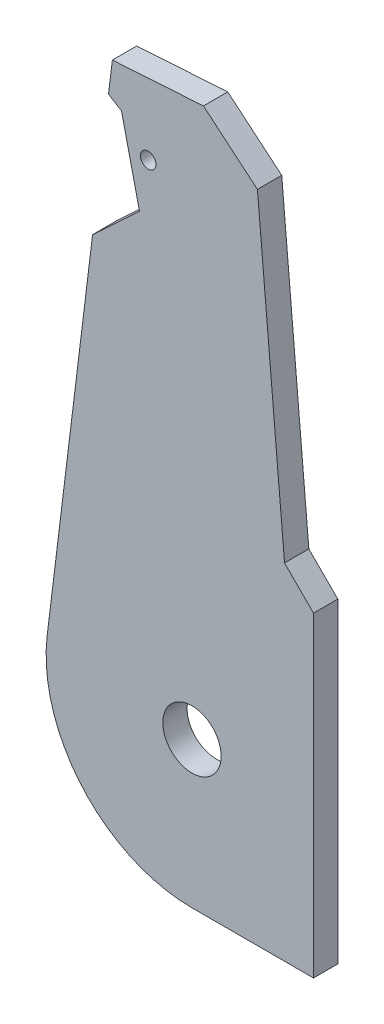
ISO-10303-21;
HEADER;
FILE_DESCRIPTION(('STEP AP214'),'2;1');
FILE_NAME('part.step','',(''),(''),'','','');
FILE_SCHEMA(('AUTOMOTIVE_DESIGN { 1 0 10303 214 1 1 1 1 }'));
ENDSEC;
DATA;
#1=APPLICATION_CONTEXT('core data for automotive mechanical design processes');
#2=APPLICATION_PROTOCOL_DEFINITION('international standard','automotive_design',2000,#1);
#3=PRODUCT_CONTEXT('',#1,'mechanical');
#4=PRODUCT('Part','Part','',(#3));
#5=PRODUCT_RELATED_PRODUCT_CATEGORY('part','',(#4));
#6=PRODUCT_DEFINITION_FORMATION('','',#4);
#7=PRODUCT_DEFINITION_CONTEXT('part definition',#1,'design');
#8=PRODUCT_DEFINITION('design','',#6,#7);
#9=PRODUCT_DEFINITION_SHAPE('','',#8);
#10=(LENGTH_UNIT() NAMED_UNIT(*) SI_UNIT(.MILLI.,.METRE.));
#11=(NAMED_UNIT(*) PLANE_ANGLE_UNIT() SI_UNIT($,.RADIAN.));
#12=(NAMED_UNIT(*) SI_UNIT($,.STERADIAN.) SOLID_ANGLE_UNIT());
#13=UNCERTAINTY_MEASURE_WITH_UNIT(LENGTH_MEASURE(1.E-05),#10,'distance_accuracy_value','');
#14=(GEOMETRIC_REPRESENTATION_CONTEXT(3) GLOBAL_UNCERTAINTY_ASSIGNED_CONTEXT((#13)) GLOBAL_UNIT_ASSIGNED_CONTEXT((#10,
#11,#12)) REPRESENTATION_CONTEXT('',''));
#15=CARTESIAN_POINT('',(0.,0.,0.));
#16=DIRECTION('',(0.,0.,1.));
#17=DIRECTION('',(1.,0.,0.));
#18=AXIS2_PLACEMENT_3D('',#15,#16,#17);
#19=CARTESIAN_POINT('',(-120.559989647342,113.233576825008,8.79187761701347));
#20=DIRECTION('',(0.992546151641323,-0.121869343405144,0.));
#21=DIRECTION('',(0.121869343405144,0.992546151641323,0.));
#22=AXIS2_PLACEMENT_3D('',#19,#20,#21);
#23=PLANE('',#22);
#24=DIRECTION('',(-0.121869343405144,-0.992546151641323,0.));
#25=VECTOR('',#24,1.);
#26=CARTESIAN_POINT('',(-120.559989647342,113.233576825008,8.79187761701347));
#27=LINE('',#26,#25);
#28=CARTESIAN_POINT('',(-124.628014575351,80.1021725336627,8.79187761701347));
#29=VERTEX_POINT('',#28);
#30=CARTESIAN_POINT('',(-133.965617421908,4.0535001444623,8.79187761701347));
#31=VERTEX_POINT('',#30);
#32=EDGE_CURVE('E161',#29,#31,#27,.T.);
#33=ORIENTED_EDGE('',*,*,#32,.F.);
#34=DIRECTION('',(0.,0.,-1.));
#35=VECTOR('',#34,1.);
#36=CARTESIAN_POINT('',(-124.628014575352,80.1021725336627,8.79187761701347));
#37=LINE('',#36,#35);
#38=CARTESIAN_POINT('',(-124.628014575351,80.1021725336627,3.79187761701347));
#39=VERTEX_POINT('',#38);
#40=EDGE_CURVE('E172',#29,#39,#37,.T.);
#41=ORIENTED_EDGE('',*,*,#40,.T.);
#42=DIRECTION('',(-0.121869343405144,-0.992546151641323,0.));
#43=VECTOR('',#42,1.);
#44=CARTESIAN_POINT('',(-120.559989647342,113.233576825008,3.79187761701347));
#45=LINE('',#44,#43);
#46=CARTESIAN_POINT('',(-133.965617421908,4.0535001444623,3.79187761701347));
#47=VERTEX_POINT('',#46);
#48=EDGE_CURVE('E154',#39,#47,#45,.T.);
#49=ORIENTED_EDGE('',*,*,#48,.T.);
#50=DIRECTION('',(0.,0.,-1.));
#51=VECTOR('',#50,1.);
#52=CARTESIAN_POINT('',(-133.965617421908,4.0535001444623,8.79187761701347));
#53=LINE('',#52,#51);
#54=EDGE_CURVE('E166',#31,#47,#53,.T.);
#55=ORIENTED_EDGE('',*,*,#54,.F.);
#56=EDGE_LOOP('',(#33,#41,#49,#55));
#57=FACE_BOUND('',#56,.T.);
#58=ADVANCED_FACE('F35',(#57),#23,.F.);
#59=CARTESIAN_POINT('',(-104.189232872668,0.397419842307961,8.79187761701347));
#60=DIRECTION('',(0.,0.,-1.));
#61=DIRECTION('',(-1.,0.,0.));
#62=AXIS2_PLACEMENT_3D('',#59,#60,#61);
#63=PLANE('',#62);
#64=CARTESIAN_POINT('',(-113.189232872668,99.0937134958599,8.79187761701347));
#65=DIRECTION('',(0.,0.,-1.));
#66=DIRECTION('',(-1.,0.,0.));
#67=AXIS2_PLACEMENT_3D('',#64,#65,#66);
#68=CIRCLE('',#67,1.60000000000001);
#69=CARTESIAN_POINT('',(-114.789232872668,99.0937134958599,8.79187761701347));
#70=VERTEX_POINT('',#69);
#71=EDGE_CURVE('E226',#70,#70,#68,.T.);
#72=ORIENTED_EDGE('',*,*,#71,.T.);
#73=EDGE_LOOP('',(#72));
#74=FACE_BOUND('',#73,.T.);
#75=DIRECTION('',(1.,0.,0.));
#76=VECTOR('',#75,1.);
#77=CARTESIAN_POINT('',(-104.189232872668,-29.6025801576921,8.79187761701347));
#78=LINE('',#77,#76);
#79=CARTESIAN_POINT('',(-104.189232872668,-29.6025801576921,8.79187761701347));
#80=VERTEX_POINT('',#79);
#81=CARTESIAN_POINT('',(-79.19,-29.6025801576921,8.79187761701347));
#82=VERTEX_POINT('',#81);
#83=EDGE_CURVE('E131',#80,#82,#78,.T.);
#84=ORIENTED_EDGE('',*,*,#83,.T.);
#85=DIRECTION('',(0.,-1.,0.));
#86=VECTOR('',#85,1.);
#87=CARTESIAN_POINT('',(-79.19,114.43980887269,8.79187761701347));
#88=LINE('',#87,#86);
#89=CARTESIAN_POINT('',(-79.19,35.3981869696397,8.79187761701347));
#90=VERTEX_POINT('',#89);
#91=EDGE_CURVE('E120',#90,#82,#88,.T.);
#92=ORIENTED_EDGE('',*,*,#91,.F.);
#93=DIRECTION('',(0.707106781186543,-0.707106781186553,0.));
#94=VECTOR('',#93,1.);
#95=CARTESIAN_POINT('',(-74.1892328726681,30.3974198423077,8.79187761701347));
#96=LINE('',#95,#94);
#97=CARTESIAN_POINT('',(-85.1480008356394,41.3561878052792,8.79187761701347));
#98=VERTEX_POINT('',#97);
#99=EDGE_CURVE('E43',#90,#98,#96,.F.);
#100=ORIENTED_EDGE('',*,*,#99,.T.);
#101=DIRECTION('',(-0.0871557427476619,0.996194698091745,0.));
#102=VECTOR('',#101,1.);
#103=CARTESIAN_POINT('',(-91.5974710062196,115.073969180106,8.79187761701347));
#104=LINE('',#103,#102);
#105=CARTESIAN_POINT('',(-90.7259135787429,105.112022199189,8.79187761701347));
#106=VERTEX_POINT('',#105);
#107=EDGE_CURVE('E140',#98,#106,#104,.T.);
#108=ORIENTED_EDGE('',*,*,#107,.T.);
#109=DIRECTION('',(0.766044443118979,-0.642787609686538,0.));
#110=VECTOR('',#109,1.);
#111=CARTESIAN_POINT('',(-101.823681913159,114.424155515488,8.79187761701347));
#112=LINE('',#111,#110);
#113=CARTESIAN_POINT('',(-101.823681913159,114.424155515488,8.79187761701347));
#114=VERTEX_POINT('',#113);
#115=EDGE_CURVE('E184',#106,#114,#112,.F.);
#116=ORIENTED_EDGE('',*,*,#115,.T.);
#117=DIRECTION('',(-0.997987177795872,-0.0634160307416799,0.));
#118=VECTOR('',#117,1.);
#119=CARTESIAN_POINT('',(-120.559989647342,113.233576825008,8.79187761701347));
#120=LINE('',#119,#118);
#121=CARTESIAN_POINT('',(-120.559989647342,113.233576825008,8.79187761701347));
#122=VERTEX_POINT('',#121);
#123=EDGE_CURVE('E142',#114,#122,#120,.T.);
#124=ORIENTED_EDGE('',*,*,#123,.T.);
#125=CARTESIAN_POINT('',(-121.354234214666,106.764973920187,8.79187761701347));
#126=VERTEX_POINT('',#125);
#127=EDGE_CURVE('E144',#122,#126,#27,.T.);
#128=ORIENTED_EDGE('',*,*,#127,.T.);
#129=DIRECTION('',(0.848048096156423,-0.529919264233209,0.));
#130=VECTOR('',#129,1.);
#131=CARTESIAN_POINT('',(-61.2081507199019,69.1815297069292,8.79187761701347));
#132=LINE('',#131,#130);
#133=CARTESIAN_POINT('',(-118.679658450595,105.09371349586,8.79187761701347));
#134=VERTEX_POINT('',#133);
#135=EDGE_CURVE('E232',#126,#134,#132,.T.);
#136=ORIENTED_EDGE('',*,*,#135,.T.);
#137=DIRECTION('',(0.224951054343871,-0.974370064785234,0.));
#138=VECTOR('',#137,1.);
#139=CARTESIAN_POINT('',(-94.9984826237853,2.51927172735446,8.79187761701347));
#140=LINE('',#139,#138);
#141=CARTESIAN_POINT('',(-114.985767392586,89.0937134958599,8.79187761701347));
#142=VERTEX_POINT('',#141);
#143=EDGE_CURVE('E221',#134,#142,#140,.T.);
#144=ORIENTED_EDGE('',*,*,#143,.T.);
#145=DIRECTION('',(-0.731353701619163,-0.681998360062506,0.));
#146=VECTOR('',#145,1.);
#147=CARTESIAN_POINT('',(-153.45105301428,53.2242543610352,8.79187761701347));
#148=LINE('',#147,#146);
#149=EDGE_CURVE('E229',#142,#29,#148,.T.);
#150=ORIENTED_EDGE('',*,*,#149,.T.);
#151=ORIENTED_EDGE('',*,*,#32,.T.);
#152=CARTESIAN_POINT('',(-104.189232872668,0.397419842307961,8.79187761701347));
#153=DIRECTION('',(0.,0.,1.));
#154=DIRECTION('',(-1.,0.,0.));
#155=AXIS2_PLACEMENT_3D('',#152,#153,#154);
#156=CIRCLE('',#155,30.);
#157=EDGE_CURVE('E138',#31,#80,#156,.T.);
#158=ORIENTED_EDGE('',*,*,#157,.T.);
#159=EDGE_LOOP('',(#84,#92,#100,#108,#116,#124,#128,#136,#144,#150,#151,#158));
#160=FACE_BOUND('',#159,.T.);
#161=CARTESIAN_POINT('',(-104.189232872668,0.397419842307961,8.79187761701347));
#162=DIRECTION('',(0.,0.,1.));
#163=DIRECTION('',(1.,0.,0.));
#164=AXIS2_PLACEMENT_3D('',#161,#162,#163);
#165=CIRCLE('',#164,6.);
#166=CARTESIAN_POINT('',(-98.1892328726683,0.397419842307961,8.79187761701347));
#167=VERTEX_POINT('',#166);
#168=EDGE_CURVE('E220',#167,#167,#165,.T.);
#169=ORIENTED_EDGE('',*,*,#168,.F.);
#170=EDGE_LOOP('',(#169));
#171=FACE_BOUND('',#170,.T.);
#172=ADVANCED_FACE('F135',(#74,#160,#171),#63,.F.);
#173=CARTESIAN_POINT('',(-104.189232872668,0.397419842307961,3.79187761701347));
#174=DIRECTION('',(0.,0.,-1.));
#175=DIRECTION('',(-1.,0.,0.));
#176=AXIS2_PLACEMENT_3D('',#173,#174,#175);
#177=PLANE('',#176);
#178=DIRECTION('',(0.,1.,0.));
#179=VECTOR('',#178,1.);
#180=CARTESIAN_POINT('',(-79.19,0.397419842307964,3.79187761701347));
#181=LINE('',#180,#179);
#182=CARTESIAN_POINT('',(-79.19,-29.6025801576921,3.79187761701347));
#183=VERTEX_POINT('',#182);
#184=CARTESIAN_POINT('',(-79.19,35.3981869696397,3.79187761701347));
#185=VERTEX_POINT('',#184);
#186=EDGE_CURVE('E50',#183,#185,#181,.T.);
#187=ORIENTED_EDGE('',*,*,#186,.F.);
#188=DIRECTION('',(1.,0.,0.));
#189=VECTOR('',#188,1.);
#190=CARTESIAN_POINT('',(-104.189232872668,-29.6025801576921,3.79187761701347));
#191=LINE('',#190,#189);
#192=CARTESIAN_POINT('',(-104.189232872668,-29.6025801576921,3.79187761701347));
#193=VERTEX_POINT('',#192);
#194=EDGE_CURVE('E133',#193,#183,#191,.T.);
#195=ORIENTED_EDGE('',*,*,#194,.F.);
#196=CARTESIAN_POINT('',(-104.189232872668,0.397419842307961,3.79187761701347));
#197=DIRECTION('',(0.,0.,1.));
#198=DIRECTION('',(-1.,0.,0.));
#199=AXIS2_PLACEMENT_3D('',#196,#197,#198);
#200=CIRCLE('',#199,30.);
#201=EDGE_CURVE('E153',#47,#193,#200,.T.);
#202=ORIENTED_EDGE('',*,*,#201,.F.);
#203=ORIENTED_EDGE('',*,*,#48,.F.);
#204=DIRECTION('',(-0.731353701619164,-0.681998360062506,0.));
#205=VECTOR('',#204,1.);
#206=CARTESIAN_POINT('',(-124.628014575351,80.1021725336627,3.79187761701347));
#207=LINE('',#206,#205);
#208=CARTESIAN_POINT('',(-114.985767392586,89.0937134958599,3.79187761701347));
#209=VERTEX_POINT('',#208);
#210=EDGE_CURVE('E240',#209,#39,#207,.T.);
#211=ORIENTED_EDGE('',*,*,#210,.F.);
#212=DIRECTION('',(0.224951054343871,-0.974370064785234,0.));
#213=VECTOR('',#212,1.);
#214=CARTESIAN_POINT('',(-118.679658450595,105.09371349586,3.79187761701347));
#215=LINE('',#214,#213);
#216=CARTESIAN_POINT('',(-118.679658450595,105.09371349586,3.79187761701347));
#217=VERTEX_POINT('',#216);
#218=EDGE_CURVE('E243',#217,#209,#215,.T.);
#219=ORIENTED_EDGE('',*,*,#218,.F.);
#220=DIRECTION('',(0.848048096156423,-0.529919264233209,0.));
#221=VECTOR('',#220,1.);
#222=CARTESIAN_POINT('',(-118.679658450595,105.09371349586,3.79187761701347));
#223=LINE('',#222,#221);
#224=CARTESIAN_POINT('',(-121.354234214666,106.764973920187,3.79187761701347));
#225=VERTEX_POINT('',#224);
#226=EDGE_CURVE('E246',#225,#217,#223,.T.);
#227=ORIENTED_EDGE('',*,*,#226,.F.);
#228=CARTESIAN_POINT('',(-120.559989647342,113.233576825008,3.79187761701347));
#229=VERTEX_POINT('',#228);
#230=EDGE_CURVE('E150',#229,#225,#45,.T.);
#231=ORIENTED_EDGE('',*,*,#230,.F.);
#232=DIRECTION('',(-0.997987177795872,-0.0634160307416799,0.));
#233=VECTOR('',#232,1.);
#234=CARTESIAN_POINT('',(-120.559989647342,113.233576825008,3.79187761701347));
#235=LINE('',#234,#233);
#236=CARTESIAN_POINT('',(-101.823681913159,114.424155515488,3.79187761701347));
#237=VERTEX_POINT('',#236);
#238=EDGE_CURVE('E159',#237,#229,#235,.T.);
#239=ORIENTED_EDGE('',*,*,#238,.F.);
#240=DIRECTION('',(-0.766044443118979,0.642787609686538,0.));
#241=VECTOR('',#240,1.);
#242=CARTESIAN_POINT('',(-47.0646375287514,68.4758615689116,3.79187761701347));
#243=LINE('',#242,#241);
#244=CARTESIAN_POINT('',(-90.7259135787429,105.112022199189,3.79187761701347));
#245=VERTEX_POINT('',#244);
#246=EDGE_CURVE('E178',#237,#245,#243,.F.);
#247=ORIENTED_EDGE('',*,*,#246,.T.);
#248=DIRECTION('',(-0.0871557427476619,0.996194698091745,0.));
#249=VECTOR('',#248,1.);
#250=CARTESIAN_POINT('',(-91.5974710062196,115.073969180106,3.79187761701347));
#251=LINE('',#250,#249);
#252=CARTESIAN_POINT('',(-85.1480008356394,41.3561878052792,3.79187761701347));
#253=VERTEX_POINT('',#252);
#254=EDGE_CURVE('E157',#253,#245,#251,.T.);
#255=ORIENTED_EDGE('',*,*,#254,.F.);
#256=DIRECTION('',(-0.707106781186543,0.707106781186553,0.));
#257=VECTOR('',#256,1.);
#258=CARTESIAN_POINT('',(-85.1480008356394,41.3561878052792,3.79187761701347));
#259=LINE('',#258,#257);
#260=EDGE_CURVE('E189',#253,#185,#259,.F.);
#261=ORIENTED_EDGE('',*,*,#260,.T.);
#262=EDGE_LOOP('',(#187,#195,#202,#203,#211,#219,#227,#231,#239,#247,#255,#261));
#263=FACE_BOUND('',#262,.T.);
#264=CARTESIAN_POINT('',(-113.189232872668,99.0937134958599,3.79187761701347));
#265=DIRECTION('',(0.,0.,-1.));
#266=DIRECTION('',(-1.,0.,0.));
#267=AXIS2_PLACEMENT_3D('',#264,#265,#266);
#268=CIRCLE('',#267,1.60000000000001);
#269=CARTESIAN_POINT('',(-114.789232872668,99.0937134958599,3.79187761701347));
#270=VERTEX_POINT('',#269);
#271=EDGE_CURVE('E234',#270,#270,#268,.T.);
#272=ORIENTED_EDGE('',*,*,#271,.F.);
#273=EDGE_LOOP('',(#272));
#274=FACE_BOUND('',#273,.T.);
#275=CARTESIAN_POINT('',(-104.189232872668,0.397419842307961,3.79187761701347));
#276=DIRECTION('',(0.,0.,1.));
#277=DIRECTION('',(1.,0.,0.));
#278=AXIS2_PLACEMENT_3D('',#275,#276,#277);
#279=CIRCLE('',#278,6.);
#280=CARTESIAN_POINT('',(-98.1892328726683,0.397419842307961,3.79187761701347));
#281=VERTEX_POINT('',#280);
#282=EDGE_CURVE('E217',#281,#281,#279,.T.);
#283=ORIENTED_EDGE('',*,*,#282,.T.);
#284=EDGE_LOOP('',(#283));
#285=FACE_BOUND('',#284,.T.);
#286=ADVANCED_FACE('F193',(#263,#274,#285),#177,.T.);
#287=ORIENTED_EDGE('',*,*,#230,.T.);
#288=DIRECTION('',(0.,0.,1.));
#289=VECTOR('',#288,1.);
#290=CARTESIAN_POINT('',(-121.354234214666,106.764973920187,8.79187761701347));
#291=LINE('',#290,#289);
#292=EDGE_CURVE('E169',#225,#126,#291,.T.);
#293=ORIENTED_EDGE('',*,*,#292,.T.);
#294=ORIENTED_EDGE('',*,*,#127,.F.);
#295=DIRECTION('',(0.,0.,-1.));
#296=VECTOR('',#295,1.);
#297=CARTESIAN_POINT('',(-120.559989647342,113.233576825008,8.79187761701347));
#298=LINE('',#297,#296);
#299=EDGE_CURVE('E149',#122,#229,#298,.T.);
#300=ORIENTED_EDGE('',*,*,#299,.T.);
#301=EDGE_LOOP('',(#287,#293,#294,#300));
#302=FACE_BOUND('',#301,.T.);
#303=ADVANCED_FACE('F214',(#302),#23,.F.);
#304=CARTESIAN_POINT('',(-104.189232872668,0.397419842307961,8.79187761701347));
#305=DIRECTION('',(0.,0.,-1.));
#306=DIRECTION('',(-1.,0.,0.));
#307=AXIS2_PLACEMENT_3D('',#304,#305,#306);
#308=CYLINDRICAL_SURFACE('',#307,30.);
#309=ORIENTED_EDGE('',*,*,#201,.T.);
#310=DIRECTION('',(0.,0.,-1.));
#311=VECTOR('',#310,1.);
#312=CARTESIAN_POINT('',(-104.189232872668,-29.6025801576921,8.79187761701347));
#313=LINE('',#312,#311);
#314=EDGE_CURVE('E164',#80,#193,#313,.T.);
#315=ORIENTED_EDGE('',*,*,#314,.F.);
#316=ORIENTED_EDGE('',*,*,#157,.F.);
#317=ORIENTED_EDGE('',*,*,#54,.T.);
#318=EDGE_LOOP('',(#309,#315,#316,#317));
#319=FACE_BOUND('',#318,.T.);
#320=ADVANCED_FACE('F264',(#319),#308,.T.);
#321=CARTESIAN_POINT('',(-104.189232872668,-29.6025801576921,8.79187761701347));
#322=DIRECTION('',(0.,1.,0.));
#323=DIRECTION('',(-1.,0.,0.));
#324=AXIS2_PLACEMENT_3D('',#321,#322,#323);
#325=PLANE('',#324);
#326=ORIENTED_EDGE('',*,*,#194,.T.);
#327=DIRECTION('',(0.,0.,1.));
#328=VECTOR('',#327,1.);
#329=CARTESIAN_POINT('',(-79.19,-29.6025801576921,-1.20812238298653));
#330=LINE('',#329,#328);
#331=EDGE_CURVE('E123',#183,#82,#330,.T.);
#332=ORIENTED_EDGE('',*,*,#331,.T.);
#333=ORIENTED_EDGE('',*,*,#83,.F.);
#334=ORIENTED_EDGE('',*,*,#314,.T.);
#335=EDGE_LOOP('',(#326,#332,#333,#334));
#336=FACE_BOUND('',#335,.T.);
#337=ADVANCED_FACE('F129',(#336),#325,.F.);
#338=CARTESIAN_POINT('',(-91.5974710062196,115.073969180106,8.79187761701347));
#339=DIRECTION('',(-0.996194698091745,-0.0871557427476619,0.));
#340=DIRECTION('',(0.0871557427476619,-0.996194698091745,0.));
#341=AXIS2_PLACEMENT_3D('',#338,#339,#340);
#342=PLANE('',#341);
#343=ORIENTED_EDGE('',*,*,#107,.F.);
#344=DIRECTION('',(0.,0.,-1.));
#345=VECTOR('',#344,1.);
#346=CARTESIAN_POINT('',(-85.1480008356394,41.3561878052792,3.79187761701347));
#347=LINE('',#346,#345);
#348=EDGE_CURVE('E186',#98,#253,#347,.T.);
#349=ORIENTED_EDGE('',*,*,#348,.T.);
#350=ORIENTED_EDGE('',*,*,#254,.T.);
#351=DIRECTION('',(0.,0.,1.));
#352=VECTOR('',#351,1.);
#353=CARTESIAN_POINT('',(-90.7259135787429,105.112022199189,8.79187761701347));
#354=LINE('',#353,#352);
#355=EDGE_CURVE('E181',#245,#106,#354,.T.);
#356=ORIENTED_EDGE('',*,*,#355,.T.);
#357=EDGE_LOOP('',(#343,#349,#350,#356));
#358=FACE_BOUND('',#357,.T.);
#359=ADVANCED_FACE('F198',(#358),#342,.F.);
#360=CARTESIAN_POINT('',(-120.559989647342,113.233576825008,8.79187761701347));
#361=DIRECTION('',(0.0634160307416799,-0.997987177795872,0.));
#362=DIRECTION('',(0.997987177795872,0.0634160307416799,0.));
#363=AXIS2_PLACEMENT_3D('',#360,#361,#362);
#364=PLANE('',#363);
#365=ORIENTED_EDGE('',*,*,#123,.F.);
#366=DIRECTION('',(0.,0.,-1.));
#367=VECTOR('',#366,1.);
#368=CARTESIAN_POINT('',(-101.823681913159,114.424155515488,8.79187761701347));
#369=LINE('',#368,#367);
#370=EDGE_CURVE('E175',#114,#237,#369,.T.);
#371=ORIENTED_EDGE('',*,*,#370,.T.);
#372=ORIENTED_EDGE('',*,*,#238,.T.);
#373=ORIENTED_EDGE('',*,*,#299,.F.);
#374=EDGE_LOOP('',(#365,#371,#372,#373));
#375=FACE_BOUND('',#374,.T.);
#376=ADVANCED_FACE('F207',(#375),#364,.F.);
#377=CARTESIAN_POINT('',(-104.189232872668,0.397419842307961,8.79187761701347));
#378=DIRECTION('',(0.,0.,-1.));
#379=DIRECTION('',(-1.,0.,0.));
#380=AXIS2_PLACEMENT_3D('',#377,#378,#379);
#381=CYLINDRICAL_SURFACE('',#380,6.);
#382=ORIENTED_EDGE('',*,*,#168,.T.);
#383=EDGE_LOOP('',(#382));
#384=FACE_BOUND('',#383,.T.);
#385=ORIENTED_EDGE('',*,*,#282,.F.);
#386=EDGE_LOOP('',(#385));
#387=FACE_BOUND('',#386,.T.);
#388=ADVANCED_FACE('F295',(#384,#387),#381,.F.);
#389=CARTESIAN_POINT('',(-118.679658450595,105.09371349586,28.7918776170135));
#390=DIRECTION('',(0.974370064785234,0.224951054343871,0.));
#391=DIRECTION('',(-0.224951054343871,0.974370064785234,0.));
#392=AXIS2_PLACEMENT_3D('',#389,#390,#391);
#393=PLANE('',#392);
#394=DIRECTION('',(0.,0.,-1.));
#395=VECTOR('',#394,1.);
#396=CARTESIAN_POINT('',(-118.679658450595,105.09371349586,28.7918776170135));
#397=LINE('',#396,#395);
#398=EDGE_CURVE('E238',#134,#217,#397,.T.);
#399=ORIENTED_EDGE('',*,*,#398,.T.);
#400=ORIENTED_EDGE('',*,*,#218,.T.);
#401=DIRECTION('',(0.,0.,-1.));
#402=VECTOR('',#401,1.);
#403=CARTESIAN_POINT('',(-114.985767392586,89.0937134958599,28.7918776170135));
#404=LINE('',#403,#402);
#405=EDGE_CURVE('E237',#142,#209,#404,.T.);
#406=ORIENTED_EDGE('',*,*,#405,.F.);
#407=ORIENTED_EDGE('',*,*,#143,.F.);
#408=EDGE_LOOP('',(#399,#400,#406,#407));
#409=FACE_BOUND('',#408,.T.);
#410=ADVANCED_FACE('F257',(#409),#393,.F.);
#411=CARTESIAN_POINT('',(-124.628014575351,80.1021725336627,28.7918776170135));
#412=DIRECTION('',(0.681998360062506,-0.731353701619163,0.));
#413=DIRECTION('',(0.731353701619163,0.681998360062506,0.));
#414=AXIS2_PLACEMENT_3D('',#411,#412,#413);
#415=PLANE('',#414);
#416=ORIENTED_EDGE('',*,*,#405,.T.);
#417=ORIENTED_EDGE('',*,*,#210,.T.);
#418=ORIENTED_EDGE('',*,*,#40,.F.);
#419=ORIENTED_EDGE('',*,*,#149,.F.);
#420=EDGE_LOOP('',(#416,#417,#418,#419));
#421=FACE_BOUND('',#420,.T.);
#422=ADVANCED_FACE('F290',(#421),#415,.F.);
#423=CARTESIAN_POINT('',(-118.679658450595,105.09371349586,28.7918776170135));
#424=DIRECTION('',(0.529919264233209,0.848048096156423,0.));
#425=DIRECTION('',(-0.848048096156423,0.529919264233209,0.));
#426=AXIS2_PLACEMENT_3D('',#423,#424,#425);
#427=PLANE('',#426);
#428=ORIENTED_EDGE('',*,*,#292,.F.);
#429=ORIENTED_EDGE('',*,*,#226,.T.);
#430=ORIENTED_EDGE('',*,*,#398,.F.);
#431=ORIENTED_EDGE('',*,*,#135,.F.);
#432=EDGE_LOOP('',(#428,#429,#430,#431));
#433=FACE_BOUND('',#432,.T.);
#434=ADVANCED_FACE('F252',(#433),#427,.F.);
#435=CARTESIAN_POINT('',(-113.189232872668,99.0937134958599,28.7918776170135));
#436=DIRECTION('',(0.,0.,-1.));
#437=DIRECTION('',(-1.,0.,0.));
#438=AXIS2_PLACEMENT_3D('',#435,#436,#437);
#439=CYLINDRICAL_SURFACE('',#438,1.60000000000001);
#440=ORIENTED_EDGE('',*,*,#271,.T.);
#441=EDGE_LOOP('',(#440));
#442=FACE_BOUND('',#441,.T.);
#443=ORIENTED_EDGE('',*,*,#71,.F.);
#444=EDGE_LOOP('',(#443));
#445=FACE_BOUND('',#444,.T.);
#446=ADVANCED_FACE('F280',(#442,#445),#439,.F.);
#447=CARTESIAN_POINT('',(-101.823681913159,114.424155515488,8.79187761701347));
#448=DIRECTION('',(-0.642787609686538,-0.766044443118979,0.));
#449=DIRECTION('',(0.,0.,-1.));
#450=AXIS2_PLACEMENT_3D('',#447,#448,#449);
#451=PLANE('',#450);
#452=ORIENTED_EDGE('',*,*,#115,.F.);
#453=ORIENTED_EDGE('',*,*,#355,.F.);
#454=ORIENTED_EDGE('',*,*,#246,.F.);
#455=ORIENTED_EDGE('',*,*,#370,.F.);
#456=EDGE_LOOP('',(#452,#453,#454,#455));
#457=FACE_BOUND('',#456,.T.);
#458=ADVANCED_FACE('F210',(#457),#451,.F.);
#459=CARTESIAN_POINT('',(-85.1480008356394,41.3561878052792,8.79187761701347));
#460=DIRECTION('',(0.707106781186553,0.707106781186543,0.));
#461=DIRECTION('',(0.,0.,1.));
#462=AXIS2_PLACEMENT_3D('',#459,#460,#461);
#463=PLANE('',#462);
#464=ORIENTED_EDGE('',*,*,#99,.F.);
#465=DIRECTION('',(0.,0.,1.));
#466=VECTOR('',#465,1.);
#467=CARTESIAN_POINT('',(-79.19,35.3981869696397,8.79187761701347));
#468=LINE('',#467,#466);
#469=EDGE_CURVE('E11',#90,#185,#468,.F.);
#470=ORIENTED_EDGE('',*,*,#469,.T.);
#471=ORIENTED_EDGE('',*,*,#260,.F.);
#472=ORIENTED_EDGE('',*,*,#348,.F.);
#473=EDGE_LOOP('',(#464,#470,#471,#472));
#474=FACE_BOUND('',#473,.T.);
#475=ADVANCED_FACE('F37',(#474),#463,.T.);
#476=CARTESIAN_POINT('',(-79.19,114.43980887269,-1.20812238298653));
#477=DIRECTION('',(-1.,0.,0.));
#478=DIRECTION('',(0.,-1.,0.));
#479=AXIS2_PLACEMENT_3D('',#476,#477,#478);
#480=PLANE('',#479);
#481=ORIENTED_EDGE('',*,*,#186,.T.);
#482=ORIENTED_EDGE('',*,*,#469,.F.);
#483=ORIENTED_EDGE('',*,*,#91,.T.);
#484=ORIENTED_EDGE('',*,*,#331,.F.);
#485=EDGE_LOOP('',(#481,#482,#483,#484));
#486=FACE_BOUND('',#485,.T.);
#487=ADVANCED_FACE('F122',(#486),#480,.F.);
#488=CLOSED_SHELL('',(#58,#172,#286,#303,#320,#337,#359,#376,#388,#410,#422,#434,#446,#458,#475,#487));
#489=MANIFOLD_SOLID_BREP('B2',#488);
#490=ADVANCED_BREP_SHAPE_REPRESENTATION('',(#18,#489),#14);
#491=SHAPE_DEFINITION_REPRESENTATION(#9,#490);
ENDSEC;
END-ISO-10303-21;
